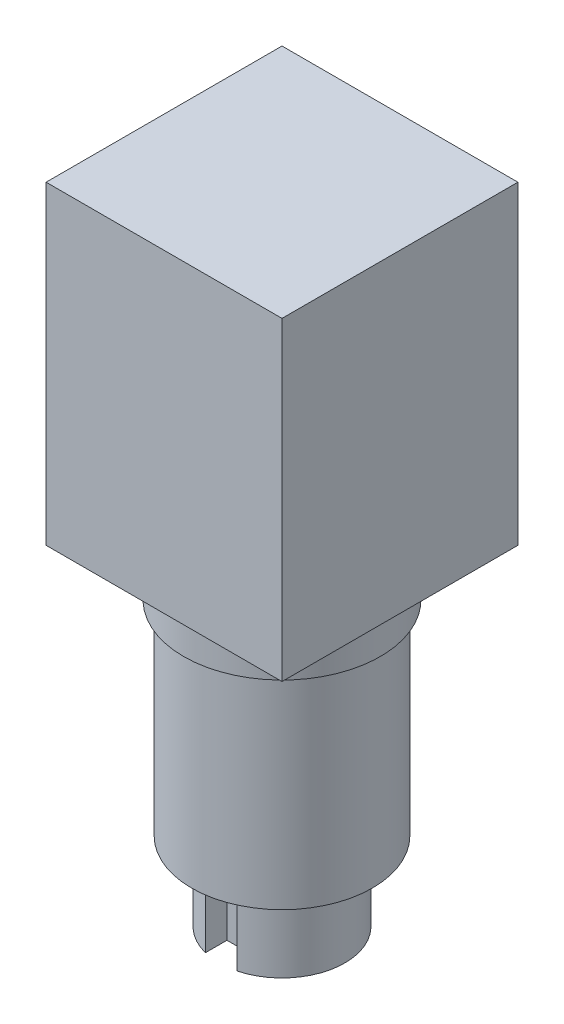
ISO-10303-21;
HEADER;
FILE_DESCRIPTION(('STEP AP214'),'2;1');
FILE_NAME('part.step','',(''),(''),'','','');
FILE_SCHEMA(('AUTOMOTIVE_DESIGN { 1 0 10303 214 1 1 1 1 }'));
ENDSEC;
DATA;
#1=APPLICATION_CONTEXT('core data for automotive mechanical design processes');
#2=APPLICATION_PROTOCOL_DEFINITION('international standard','automotive_design',2000,#1);
#3=PRODUCT_CONTEXT('',#1,'mechanical');
#4=PRODUCT('Part','Part','',(#3));
#5=PRODUCT_RELATED_PRODUCT_CATEGORY('part','',(#4));
#6=PRODUCT_DEFINITION_FORMATION('','',#4);
#7=PRODUCT_DEFINITION_CONTEXT('part definition',#1,'design');
#8=PRODUCT_DEFINITION('design','',#6,#7);
#9=PRODUCT_DEFINITION_SHAPE('','',#8);
#10=(LENGTH_UNIT() NAMED_UNIT(*) SI_UNIT(.MILLI.,.METRE.));
#11=(NAMED_UNIT(*) PLANE_ANGLE_UNIT() SI_UNIT($,.RADIAN.));
#12=(NAMED_UNIT(*) SI_UNIT($,.STERADIAN.) SOLID_ANGLE_UNIT());
#13=UNCERTAINTY_MEASURE_WITH_UNIT(LENGTH_MEASURE(1.E-05),#10,'distance_accuracy_value','');
#14=(GEOMETRIC_REPRESENTATION_CONTEXT(3) GLOBAL_UNCERTAINTY_ASSIGNED_CONTEXT((#13)) GLOBAL_UNIT_ASSIGNED_CONTEXT((#10,
#11,#12)) REPRESENTATION_CONTEXT('',''));
#15=CARTESIAN_POINT('',(0.,0.,0.));
#16=DIRECTION('',(0.,0.,1.));
#17=DIRECTION('',(1.,0.,0.));
#18=AXIS2_PLACEMENT_3D('',#15,#16,#17);
#19=CARTESIAN_POINT('',(0.,5.,0.));
#20=DIRECTION('',(0.,-1.,0.));
#21=DIRECTION('',(0.,0.,-1.));
#22=AXIS2_PLACEMENT_3D('',#19,#20,#21);
#23=CYLINDRICAL_SURFACE('',#22,4.);
#24=CARTESIAN_POINT('',(0.,0.,0.));
#25=DIRECTION('',(0.,1.,0.));
#26=DIRECTION('',(0.,0.,1.));
#27=AXIS2_PLACEMENT_3D('',#24,#25,#26);
#28=CIRCLE('',#27,4.);
#29=CARTESIAN_POINT('',(1.,0.,3.87298334620742));
#30=VERTEX_POINT('',#29);
#31=CARTESIAN_POINT('',(-1.,0.,3.87298334620742));
#32=VERTEX_POINT('',#31);
#33=EDGE_CURVE('E56',#30,#32,#28,.T.);
#34=ORIENTED_EDGE('',*,*,#33,.T.);
#35=DIRECTION('',(0.,-1.,0.));
#36=VECTOR('',#35,1.);
#37=CARTESIAN_POINT('',(-1.,5.,3.87298334620742));
#38=LINE('',#37,#36);
#39=CARTESIAN_POINT('',(-1.,5.,3.87298334620742));
#40=VERTEX_POINT('',#39);
#41=EDGE_CURVE('E133',#32,#40,#38,.F.);
#42=ORIENTED_EDGE('',*,*,#41,.T.);
#43=CARTESIAN_POINT('',(0.,5.,0.));
#44=DIRECTION('',(0.,1.,0.));
#45=DIRECTION('',(0.,0.,1.));
#46=AXIS2_PLACEMENT_3D('',#43,#44,#45);
#47=CIRCLE('',#46,4.);
#48=CARTESIAN_POINT('',(1.,5.,3.87298334620742));
#49=VERTEX_POINT('',#48);
#50=EDGE_CURVE('E11',#49,#40,#47,.T.);
#51=ORIENTED_EDGE('',*,*,#50,.F.);
#52=DIRECTION('',(0.,-1.,0.));
#53=VECTOR('',#52,1.);
#54=CARTESIAN_POINT('',(1.,5.,3.87298334620742));
#55=LINE('',#54,#53);
#56=EDGE_CURVE('E154',#49,#30,#55,.T.);
#57=ORIENTED_EDGE('',*,*,#56,.T.);
#58=EDGE_LOOP('',(#34,#42,#51,#57));
#59=FACE_BOUND('',#58,.T.);
#60=ADVANCED_FACE('F48',(#59),#23,.T.);
#61=CARTESIAN_POINT('',(0.,0.,0.));
#62=DIRECTION('',(0.,1.,0.));
#63=DIRECTION('',(0.,0.,1.));
#64=AXIS2_PLACEMENT_3D('',#61,#62,#63);
#65=PLANE('',#64);
#66=CARTESIAN_POINT('',(0.,0.,0.));
#67=DIRECTION('',(0.,-1.,0.));
#68=DIRECTION('',(0.,0.,-1.));
#69=AXIS2_PLACEMENT_3D('',#66,#67,#68);
#70=CIRCLE('',#69,1.025);
#71=CARTESIAN_POINT('',(0.,0.,-1.025));
#72=VERTEX_POINT('',#71);
#73=EDGE_CURVE('E167',#72,#72,#70,.T.);
#74=ORIENTED_EDGE('',*,*,#73,.F.);
#75=EDGE_LOOP('',(#74));
#76=FACE_BOUND('',#75,.T.);
#77=DIRECTION('',(1.,0.,0.));
#78=VECTOR('',#77,1.);
#79=CARTESIAN_POINT('',(-1.,0.,2.5));
#80=LINE('',#79,#78);
#81=CARTESIAN_POINT('',(-1.,0.,2.5));
#82=VERTEX_POINT('',#81);
#83=CARTESIAN_POINT('',(1.,0.,2.5));
#84=VERTEX_POINT('',#83);
#85=EDGE_CURVE('E64',#82,#84,#80,.T.);
#86=ORIENTED_EDGE('',*,*,#85,.F.);
#87=DIRECTION('',(0.,0.,-1.));
#88=VECTOR('',#87,1.);
#89=CARTESIAN_POINT('',(-1.,0.,5.5));
#90=LINE('',#89,#88);
#91=EDGE_CURVE('E129',#32,#82,#90,.T.);
#92=ORIENTED_EDGE('',*,*,#91,.F.);
#93=ORIENTED_EDGE('',*,*,#33,.F.);
#94=DIRECTION('',(0.,0.,1.));
#95=VECTOR('',#94,1.);
#96=CARTESIAN_POINT('',(1.,0.,5.5));
#97=LINE('',#96,#95);
#98=EDGE_CURVE('E137',#84,#30,#97,.T.);
#99=ORIENTED_EDGE('',*,*,#98,.F.);
#100=EDGE_LOOP('',(#86,#92,#93,#99));
#101=FACE_BOUND('',#100,.T.);
#102=ADVANCED_FACE('F146',(#76,#101),#65,.F.);
#103=CARTESIAN_POINT('',(0.,21.,0.));
#104=DIRECTION('',(0.,-1.,0.));
#105=DIRECTION('',(0.,0.,-1.));
#106=AXIS2_PLACEMENT_3D('',#103,#104,#105);
#107=CYLINDRICAL_SURFACE('',#106,5.75);
#108=CARTESIAN_POINT('',(0.,18.,0.));
#109=DIRECTION('',(0.,-1.,0.));
#110=DIRECTION('',(0.,0.,-1.));
#111=AXIS2_PLACEMENT_3D('',#108,#109,#110);
#112=CIRCLE('',#111,5.75);
#113=CARTESIAN_POINT('',(0.,18.,-5.75));
#114=VERTEX_POINT('',#113);
#115=EDGE_CURVE('E51',#114,#114,#112,.T.);
#116=ORIENTED_EDGE('',*,*,#115,.T.);
#117=EDGE_LOOP('',(#116));
#118=FACE_BOUND('',#117,.T.);
#119=CARTESIAN_POINT('',(0.,5.,0.));
#120=DIRECTION('',(0.,1.,0.));
#121=DIRECTION('',(0.,0.,1.));
#122=AXIS2_PLACEMENT_3D('',#119,#120,#121);
#123=CIRCLE('',#122,5.75);
#124=CARTESIAN_POINT('',(0.,5.,5.75));
#125=VERTEX_POINT('',#124);
#126=EDGE_CURVE('E199',#125,#125,#123,.T.);
#127=ORIENTED_EDGE('',*,*,#126,.T.);
#128=EDGE_LOOP('',(#127));
#129=FACE_BOUND('',#128,.T.);
#130=ADVANCED_FACE('F210',(#118,#129),#107,.T.);
#131=CARTESIAN_POINT('',(0.,5.,0.));
#132=DIRECTION('',(0.,1.,0.));
#133=DIRECTION('',(0.,0.,1.));
#134=AXIS2_PLACEMENT_3D('',#131,#132,#133);
#135=PLANE('',#134);
#136=ORIENTED_EDGE('',*,*,#50,.T.);
#137=DIRECTION('',(0.,0.,-1.));
#138=VECTOR('',#137,1.);
#139=CARTESIAN_POINT('',(-1.,5.,5.5));
#140=LINE('',#139,#138);
#141=CARTESIAN_POINT('',(-1.,5.,2.5));
#142=VERTEX_POINT('',#141);
#143=EDGE_CURVE('E143',#40,#142,#140,.T.);
#144=ORIENTED_EDGE('',*,*,#143,.T.);
#145=DIRECTION('',(1.,0.,0.));
#146=VECTOR('',#145,1.);
#147=CARTESIAN_POINT('',(-1.,5.,2.5));
#148=LINE('',#147,#146);
#149=CARTESIAN_POINT('',(1.,5.,2.5));
#150=VERTEX_POINT('',#149);
#151=EDGE_CURVE('E142',#142,#150,#148,.T.);
#152=ORIENTED_EDGE('',*,*,#151,.T.);
#153=DIRECTION('',(0.,0.,1.));
#154=VECTOR('',#153,1.);
#155=CARTESIAN_POINT('',(1.,5.,5.5));
#156=LINE('',#155,#154);
#157=EDGE_CURVE('E151',#150,#49,#156,.T.);
#158=ORIENTED_EDGE('',*,*,#157,.T.);
#159=EDGE_LOOP('',(#136,#144,#152,#158));
#160=FACE_BOUND('',#159,.T.);
#161=ORIENTED_EDGE('',*,*,#126,.F.);
#162=EDGE_LOOP('',(#161));
#163=FACE_BOUND('',#162,.T.);
#164=ADVANCED_FACE('F206',(#160,#163),#135,.F.);
#165=CARTESIAN_POINT('',(0.,15.,0.));
#166=DIRECTION('',(0.,-1.,0.));
#167=DIRECTION('',(0.,0.,-1.));
#168=AXIS2_PLACEMENT_3D('',#165,#166,#167);
#169=CONICAL_SURFACE('',#168,0.799999999999996,1.02974425867665);
#170=CARTESIAN_POINT('',(0.,15.4806884952221,0.));
#171=VERTEX_POINT('',#170);
#172=VERTEX_LOOP('',#171);
#173=FACE_BOUND('',#172,.T.);
#174=CARTESIAN_POINT('',(0.,15.,0.));
#175=DIRECTION('',(0.,-1.,0.));
#176=DIRECTION('',(0.,0.,-1.));
#177=AXIS2_PLACEMENT_3D('',#174,#175,#176);
#178=CIRCLE('',#177,0.799999999999996);
#179=CARTESIAN_POINT('',(0.,15.,-0.799999999999996));
#180=VERTEX_POINT('',#179);
#181=EDGE_CURVE('E173',#180,#180,#178,.T.);
#182=ORIENTED_EDGE('',*,*,#181,.T.);
#183=EDGE_LOOP('',(#182));
#184=FACE_BOUND('',#183,.T.);
#185=ADVANCED_FACE('F209',(#173,#184),#169,.F.);
#186=CARTESIAN_POINT('',(0.,0.,0.));
#187=DIRECTION('',(0.,-1.,0.));
#188=DIRECTION('',(0.,0.,-1.));
#189=AXIS2_PLACEMENT_3D('',#186,#187,#188);
#190=CYLINDRICAL_SURFACE('',#189,0.799999999999995);
#191=ORIENTED_EDGE('',*,*,#181,.F.);
#192=EDGE_LOOP('',(#191));
#193=FACE_BOUND('',#192,.T.);
#194=CARTESIAN_POINT('',(0.,0.225000000000003,0.));
#195=DIRECTION('',(0.,-1.,0.));
#196=DIRECTION('',(0.,0.,-1.));
#197=AXIS2_PLACEMENT_3D('',#194,#195,#196);
#198=CIRCLE('',#197,0.799999999999995);
#199=CARTESIAN_POINT('',(0.,0.225000000000003,-0.799999999999995));
#200=VERTEX_POINT('',#199);
#201=EDGE_CURVE('E170',#200,#200,#198,.T.);
#202=ORIENTED_EDGE('',*,*,#201,.T.);
#203=EDGE_LOOP('',(#202));
#204=FACE_BOUND('',#203,.T.);
#205=ADVANCED_FACE('F251',(#193,#204),#190,.F.);
#206=CARTESIAN_POINT('',(0.,0.,0.));
#207=DIRECTION('',(0.,-1.,0.));
#208=DIRECTION('',(0.,0.,-1.));
#209=AXIS2_PLACEMENT_3D('',#206,#207,#208);
#210=CONICAL_SURFACE('',#209,1.025,0.785398163397448);
#211=ORIENTED_EDGE('',*,*,#201,.F.);
#212=EDGE_LOOP('',(#211));
#213=FACE_BOUND('',#212,.T.);
#214=ORIENTED_EDGE('',*,*,#73,.T.);
#215=EDGE_LOOP('',(#214));
#216=FACE_BOUND('',#215,.T.);
#217=ADVANCED_FACE('F263',(#213,#216),#210,.F.);
#218=CARTESIAN_POINT('',(0.,18.,0.));
#219=DIRECTION('',(0.,1.,0.));
#220=DIRECTION('',(0.,0.,1.));
#221=AXIS2_PLACEMENT_3D('',#218,#219,#220);
#222=CYLINDRICAL_SURFACE('',#221,6.25);
#223=CARTESIAN_POINT('',(0.,18.,0.));
#224=DIRECTION('',(0.,-1.,0.));
#225=DIRECTION('',(0.,0.,-1.));
#226=AXIS2_PLACEMENT_3D('',#223,#224,#225);
#227=CIRCLE('',#226,6.25);
#228=CARTESIAN_POINT('',(0.,18.,-6.25));
#229=VERTEX_POINT('',#228);
#230=EDGE_CURVE('E162',#229,#229,#227,.T.);
#231=ORIENTED_EDGE('',*,*,#230,.F.);
#232=EDGE_LOOP('',(#231));
#233=FACE_BOUND('',#232,.T.);
#234=CARTESIAN_POINT('',(0.,21.,0.));
#235=DIRECTION('',(0.,-1.,0.));
#236=DIRECTION('',(0.,0.,-1.));
#237=AXIS2_PLACEMENT_3D('',#234,#235,#236);
#238=CIRCLE('',#237,6.25);
#239=CARTESIAN_POINT('',(0.,21.,-6.25));
#240=VERTEX_POINT('',#239);
#241=EDGE_CURVE('E161',#240,#240,#238,.T.);
#242=ORIENTED_EDGE('',*,*,#241,.T.);
#243=EDGE_LOOP('',(#242));
#244=FACE_BOUND('',#243,.T.);
#245=ADVANCED_FACE('F273',(#233,#244),#222,.T.);
#246=CARTESIAN_POINT('',(0.,18.,0.));
#247=DIRECTION('',(0.,-1.,0.));
#248=DIRECTION('',(0.,0.,-1.));
#249=AXIS2_PLACEMENT_3D('',#246,#247,#248);
#250=PLANE('',#249);
#251=ORIENTED_EDGE('',*,*,#115,.F.);
#252=EDGE_LOOP('',(#251));
#253=FACE_BOUND('',#252,.T.);
#254=ORIENTED_EDGE('',*,*,#230,.T.);
#255=EDGE_LOOP('',(#254));
#256=FACE_BOUND('',#255,.T.);
#257=ADVANCED_FACE('F281',(#253,#256),#250,.T.);
#258=CARTESIAN_POINT('',(0.,41.,0.));
#259=DIRECTION('',(0.,-1.,0.));
#260=DIRECTION('',(0.,0.,-1.));
#261=AXIS2_PLACEMENT_3D('',#258,#259,#260);
#262=PLANE('',#261);
#263=DIRECTION('',(0.,0.,-1.));
#264=VECTOR('',#263,1.);
#265=CARTESIAN_POINT('',(7.5,41.,7.5));
#266=LINE('',#265,#264);
#267=CARTESIAN_POINT('',(7.5,41.,7.5));
#268=VERTEX_POINT('',#267);
#269=CARTESIAN_POINT('',(7.5,41.,-7.5));
#270=VERTEX_POINT('',#269);
#271=EDGE_CURVE('E177',#268,#270,#266,.T.);
#272=ORIENTED_EDGE('',*,*,#271,.T.);
#273=DIRECTION('',(-1.,0.,0.));
#274=VECTOR('',#273,1.);
#275=CARTESIAN_POINT('',(-7.5,41.,-7.5));
#276=LINE('',#275,#274);
#277=CARTESIAN_POINT('',(-7.5,41.,-7.5));
#278=VERTEX_POINT('',#277);
#279=EDGE_CURVE('E102',#270,#278,#276,.T.);
#280=ORIENTED_EDGE('',*,*,#279,.T.);
#281=DIRECTION('',(0.,0.,1.));
#282=VECTOR('',#281,1.);
#283=CARTESIAN_POINT('',(-7.5,41.,7.5));
#284=LINE('',#283,#282);
#285=CARTESIAN_POINT('',(-7.5,41.,7.5));
#286=VERTEX_POINT('',#285);
#287=EDGE_CURVE('E180',#278,#286,#284,.T.);
#288=ORIENTED_EDGE('',*,*,#287,.T.);
#289=DIRECTION('',(1.,0.,0.));
#290=VECTOR('',#289,1.);
#291=CARTESIAN_POINT('',(-7.5,41.,7.5));
#292=LINE('',#291,#290);
#293=EDGE_CURVE('E73',#286,#268,#292,.T.);
#294=ORIENTED_EDGE('',*,*,#293,.T.);
#295=EDGE_LOOP('',(#272,#280,#288,#294));
#296=FACE_BOUND('',#295,.T.);
#297=ADVANCED_FACE('F291',(#296),#262,.F.);
#298=CARTESIAN_POINT('',(-7.5,41.,-7.5));
#299=DIRECTION('',(0.,0.,1.));
#300=DIRECTION('',(1.,0.,0.));
#301=AXIS2_PLACEMENT_3D('',#298,#299,#300);
#302=PLANE('',#301);
#303=DIRECTION('',(-1.,0.,0.));
#304=VECTOR('',#303,1.);
#305=CARTESIAN_POINT('',(-7.5,21.,-7.5));
#306=LINE('',#305,#304);
#307=CARTESIAN_POINT('',(7.5,21.,-7.5));
#308=VERTEX_POINT('',#307);
#309=CARTESIAN_POINT('',(-7.5,21.,-7.5));
#310=VERTEX_POINT('',#309);
#311=EDGE_CURVE('E186',#308,#310,#306,.T.);
#312=ORIENTED_EDGE('',*,*,#311,.T.);
#313=DIRECTION('',(0.,-1.,0.));
#314=VECTOR('',#313,1.);
#315=CARTESIAN_POINT('',(-7.5,41.,-7.5));
#316=LINE('',#315,#314);
#317=EDGE_CURVE('E194',#278,#310,#316,.T.);
#318=ORIENTED_EDGE('',*,*,#317,.F.);
#319=ORIENTED_EDGE('',*,*,#279,.F.);
#320=DIRECTION('',(0.,-1.,0.));
#321=VECTOR('',#320,1.);
#322=CARTESIAN_POINT('',(7.5,41.,-7.5));
#323=LINE('',#322,#321);
#324=EDGE_CURVE('E197',#270,#308,#323,.T.);
#325=ORIENTED_EDGE('',*,*,#324,.T.);
#326=EDGE_LOOP('',(#312,#318,#319,#325));
#327=FACE_BOUND('',#326,.T.);
#328=ADVANCED_FACE('F301',(#327),#302,.F.);
#329=CARTESIAN_POINT('',(-7.5,41.,7.5));
#330=DIRECTION('',(1.,0.,0.));
#331=DIRECTION('',(0.,0.,-1.));
#332=AXIS2_PLACEMENT_3D('',#329,#330,#331);
#333=PLANE('',#332);
#334=DIRECTION('',(0.,0.,1.));
#335=VECTOR('',#334,1.);
#336=CARTESIAN_POINT('',(-7.5,21.,7.5));
#337=LINE('',#336,#335);
#338=CARTESIAN_POINT('',(-7.5,21.,7.5));
#339=VERTEX_POINT('',#338);
#340=EDGE_CURVE('E188',#310,#339,#337,.T.);
#341=ORIENTED_EDGE('',*,*,#340,.T.);
#342=DIRECTION('',(0.,-1.,0.));
#343=VECTOR('',#342,1.);
#344=CARTESIAN_POINT('',(-7.5,41.,7.5));
#345=LINE('',#344,#343);
#346=EDGE_CURVE('E192',#286,#339,#345,.T.);
#347=ORIENTED_EDGE('',*,*,#346,.F.);
#348=ORIENTED_EDGE('',*,*,#287,.F.);
#349=ORIENTED_EDGE('',*,*,#317,.T.);
#350=EDGE_LOOP('',(#341,#347,#348,#349));
#351=FACE_BOUND('',#350,.T.);
#352=ADVANCED_FACE('F311',(#351),#333,.F.);
#353=CARTESIAN_POINT('',(-7.5,41.,7.5));
#354=DIRECTION('',(0.,0.,-1.));
#355=DIRECTION('',(-1.,0.,0.));
#356=AXIS2_PLACEMENT_3D('',#353,#354,#355);
#357=PLANE('',#356);
#358=DIRECTION('',(1.,0.,0.));
#359=VECTOR('',#358,1.);
#360=CARTESIAN_POINT('',(-7.5,21.,7.5));
#361=LINE('',#360,#359);
#362=CARTESIAN_POINT('',(7.5,21.,7.5));
#363=VERTEX_POINT('',#362);
#364=EDGE_CURVE('E94',#339,#363,#361,.T.);
#365=ORIENTED_EDGE('',*,*,#364,.T.);
#366=DIRECTION('',(0.,-1.,0.));
#367=VECTOR('',#366,1.);
#368=CARTESIAN_POINT('',(7.5,41.,7.5));
#369=LINE('',#368,#367);
#370=EDGE_CURVE('E183',#268,#363,#369,.T.);
#371=ORIENTED_EDGE('',*,*,#370,.F.);
#372=ORIENTED_EDGE('',*,*,#293,.F.);
#373=ORIENTED_EDGE('',*,*,#346,.T.);
#374=EDGE_LOOP('',(#365,#371,#372,#373));
#375=FACE_BOUND('',#374,.T.);
#376=ADVANCED_FACE('F321',(#375),#357,.F.);
#377=CARTESIAN_POINT('',(7.5,41.,7.5));
#378=DIRECTION('',(-1.,0.,0.));
#379=DIRECTION('',(0.,0.,1.));
#380=AXIS2_PLACEMENT_3D('',#377,#378,#379);
#381=PLANE('',#380);
#382=DIRECTION('',(0.,0.,-1.));
#383=VECTOR('',#382,1.);
#384=CARTESIAN_POINT('',(7.5,21.,7.5));
#385=LINE('',#384,#383);
#386=EDGE_CURVE('E176',#363,#308,#385,.T.);
#387=ORIENTED_EDGE('',*,*,#386,.T.);
#388=ORIENTED_EDGE('',*,*,#324,.F.);
#389=ORIENTED_EDGE('',*,*,#271,.F.);
#390=ORIENTED_EDGE('',*,*,#370,.T.);
#391=EDGE_LOOP('',(#387,#388,#389,#390));
#392=FACE_BOUND('',#391,.T.);
#393=ADVANCED_FACE('F330',(#392),#381,.F.);
#394=CARTESIAN_POINT('',(0.,21.,0.));
#395=DIRECTION('',(0.,-1.,0.));
#396=DIRECTION('',(0.,0.,-1.));
#397=AXIS2_PLACEMENT_3D('',#394,#395,#396);
#398=PLANE('',#397);
#399=ORIENTED_EDGE('',*,*,#241,.F.);
#400=EDGE_LOOP('',(#399));
#401=FACE_BOUND('',#400,.T.);
#402=ORIENTED_EDGE('',*,*,#386,.F.);
#403=ORIENTED_EDGE('',*,*,#364,.F.);
#404=ORIENTED_EDGE('',*,*,#340,.F.);
#405=ORIENTED_EDGE('',*,*,#311,.F.);
#406=EDGE_LOOP('',(#402,#403,#404,#405));
#407=FACE_BOUND('',#406,.T.);
#408=ADVANCED_FACE('F338',(#401,#407),#398,.T.);
#409=CARTESIAN_POINT('',(-1.,8.60555127546399,5.5));
#410=DIRECTION('',(-1.,0.,0.));
#411=DIRECTION('',(0.,0.,1.));
#412=AXIS2_PLACEMENT_3D('',#409,#410,#411);
#413=PLANE('',#412);
#414=ORIENTED_EDGE('',*,*,#91,.T.);
#415=DIRECTION('',(0.,-1.,0.));
#416=VECTOR('',#415,1.);
#417=CARTESIAN_POINT('',(-1.,8.60555127546399,2.5));
#418=LINE('',#417,#416);
#419=EDGE_CURVE('E131',#142,#82,#418,.T.);
#420=ORIENTED_EDGE('',*,*,#419,.F.);
#421=ORIENTED_EDGE('',*,*,#143,.F.);
#422=ORIENTED_EDGE('',*,*,#41,.F.);
#423=EDGE_LOOP('',(#414,#420,#421,#422));
#424=FACE_BOUND('',#423,.T.);
#425=ADVANCED_FACE('F130',(#424),#413,.F.);
#426=CARTESIAN_POINT('',(1.,8.60555127546399,5.5));
#427=DIRECTION('',(1.,0.,0.));
#428=DIRECTION('',(0.,0.,-1.));
#429=AXIS2_PLACEMENT_3D('',#426,#427,#428);
#430=PLANE('',#429);
#431=ORIENTED_EDGE('',*,*,#157,.F.);
#432=DIRECTION('',(0.,-1.,0.));
#433=VECTOR('',#432,1.);
#434=CARTESIAN_POINT('',(1.,8.60555127546399,2.5));
#435=LINE('',#434,#433);
#436=EDGE_CURVE('E155',#150,#84,#435,.T.);
#437=ORIENTED_EDGE('',*,*,#436,.T.);
#438=ORIENTED_EDGE('',*,*,#98,.T.);
#439=ORIENTED_EDGE('',*,*,#56,.F.);
#440=EDGE_LOOP('',(#431,#437,#438,#439));
#441=FACE_BOUND('',#440,.T.);
#442=ADVANCED_FACE('F204',(#441),#430,.F.);
#443=CARTESIAN_POINT('',(-1.,8.60555127546399,2.5));
#444=DIRECTION('',(0.,0.,-1.));
#445=DIRECTION('',(-1.,0.,0.));
#446=AXIS2_PLACEMENT_3D('',#443,#444,#445);
#447=PLANE('',#446);
#448=ORIENTED_EDGE('',*,*,#419,.T.);
#449=ORIENTED_EDGE('',*,*,#85,.T.);
#450=ORIENTED_EDGE('',*,*,#436,.F.);
#451=ORIENTED_EDGE('',*,*,#151,.F.);
#452=EDGE_LOOP('',(#448,#449,#450,#451));
#453=FACE_BOUND('',#452,.T.);
#454=ADVANCED_FACE('F140',(#453),#447,.F.);
#455=CLOSED_SHELL('',(#60,#102,#130,#164,#185,#205,#217,#245,#257,#297,#328,#352,#376,#393,#408,
#425,#442,#454));
#456=MANIFOLD_SOLID_BREP('B2',#455);
#457=ADVANCED_BREP_SHAPE_REPRESENTATION('',(#18,#456),#14);
#458=SHAPE_DEFINITION_REPRESENTATION(#9,#457);
ENDSEC;
END-ISO-10303-21;
